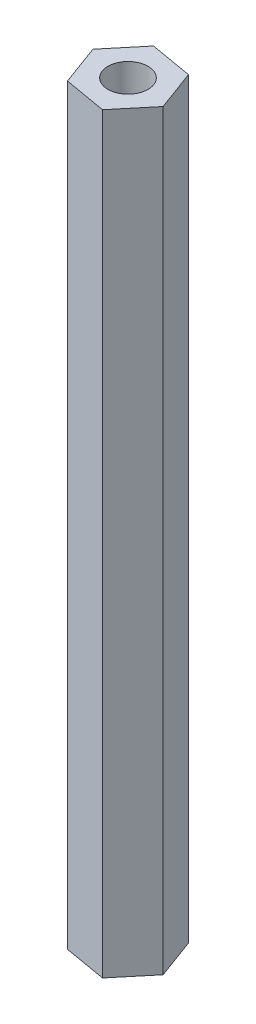
ISO-10303-21;
HEADER;
FILE_DESCRIPTION(('STEP AP214'),'2;1');
FILE_NAME('part.step','',(''),(''),'','','');
FILE_SCHEMA(('AUTOMOTIVE_DESIGN { 1 0 10303 214 1 1 1 1 }'));
ENDSEC;
DATA;
#1=APPLICATION_CONTEXT('core data for automotive mechanical design processes');
#2=APPLICATION_PROTOCOL_DEFINITION('international standard','automotive_design',2000,#1);
#3=PRODUCT_CONTEXT('',#1,'mechanical');
#4=PRODUCT('Part','Part','',(#3));
#5=PRODUCT_RELATED_PRODUCT_CATEGORY('part','',(#4));
#6=PRODUCT_DEFINITION_FORMATION('','',#4);
#7=PRODUCT_DEFINITION_CONTEXT('part definition',#1,'design');
#8=PRODUCT_DEFINITION('design','',#6,#7);
#9=PRODUCT_DEFINITION_SHAPE('','',#8);
#10=(LENGTH_UNIT() NAMED_UNIT(*) SI_UNIT(.MILLI.,.METRE.));
#11=(NAMED_UNIT(*) PLANE_ANGLE_UNIT() SI_UNIT($,.RADIAN.));
#12=(NAMED_UNIT(*) SI_UNIT($,.STERADIAN.) SOLID_ANGLE_UNIT());
#13=UNCERTAINTY_MEASURE_WITH_UNIT(LENGTH_MEASURE(1.E-05),#10,'distance_accuracy_value','');
#14=(GEOMETRIC_REPRESENTATION_CONTEXT(3) GLOBAL_UNCERTAINTY_ASSIGNED_CONTEXT((#13)) GLOBAL_UNIT_ASSIGNED_CONTEXT((#10,
#11,#12)) REPRESENTATION_CONTEXT('',''));
#15=CARTESIAN_POINT('',(0.,0.,0.));
#16=DIRECTION('',(0.,0.,1.));
#17=DIRECTION('',(1.,0.,0.));
#18=AXIS2_PLACEMENT_3D('',#15,#16,#17);
#19=CARTESIAN_POINT('',(0.,52.5,0.));
#20=DIRECTION('',(0.,1.,0.));
#21=DIRECTION('',(0.,0.,1.));
#22=AXIS2_PLACEMENT_3D('',#19,#20,#21);
#23=PLANE('',#22);
#24=DIRECTION('',(0.985494120976988,0.,0.169709568144505));
#25=VECTOR('',#24,1.);
#26=CARTESIAN_POINT('',(-1.91915957324162,52.5,2.30582447990324));
#27=LINE('',#26,#25);
#28=CARTESIAN_POINT('',(-1.91915957324162,52.5,2.30582447990324));
#29=VERTEX_POINT('',#28);
#30=CARTESIAN_POINT('',(1.03732278969237,52.5,2.81495318433728));
#31=VERTEX_POINT('',#30);
#32=EDGE_CURVE('E152',#29,#31,#27,.T.);
#33=ORIENTED_EDGE('',*,*,#32,.T.);
#34=DIRECTION('',(0.639719857783097,0.,-0.768608159960571));
#35=VECTOR('',#34,1.);
#36=CARTESIAN_POINT('',(1.03732278969237,52.5,2.81495318433728));
#37=LINE('',#36,#35);
#38=CARTESIAN_POINT('',(2.95648236296242,52.5,0.509128704550776));
#39=VERTEX_POINT('',#38);
#40=EDGE_CURVE('E100',#31,#39,#37,.T.);
#41=ORIENTED_EDGE('',*,*,#40,.T.);
#42=DIRECTION('',(-0.345774263226371,0.,-0.93831772811253));
#43=VECTOR('',#42,1.);
#44=CARTESIAN_POINT('',(2.95648236296242,52.5,0.509128704550776));
#45=LINE('',#44,#43);
#46=CARTESIAN_POINT('',(1.9191595732404,52.5,-2.30582447990324));
#47=VERTEX_POINT('',#46);
#48=EDGE_CURVE('E113',#39,#47,#45,.T.);
#49=ORIENTED_EDGE('',*,*,#48,.T.);
#50=DIRECTION('',(-0.985494120976422,0.,-0.169709568147791));
#51=VECTOR('',#50,1.);
#52=CARTESIAN_POINT('',(1.9191595732404,52.5,-2.30582447990324));
#53=LINE('',#52,#51);
#54=CARTESIAN_POINT('',(-1.03732278963464,52.5,-2.81495318433728));
#55=VERTEX_POINT('',#54);
#56=EDGE_CURVE('E107',#47,#55,#53,.T.);
#57=ORIENTED_EDGE('',*,*,#56,.T.);
#58=DIRECTION('',(-0.639719857775391,0.,0.768608159966985));
#59=VECTOR('',#58,1.);
#60=CARTESIAN_POINT('',(-1.03732278963464,52.5,-2.81495318433728));
#61=LINE('',#60,#59);
#62=CARTESIAN_POINT('',(-2.95648236296253,52.5,-0.509128704434259));
#63=VERTEX_POINT('',#62);
#64=EDGE_CURVE('E111',#55,#63,#61,.T.);
#65=ORIENTED_EDGE('',*,*,#64,.T.);
#66=DIRECTION('',(0.345774263238647,0.,0.938317728108007));
#67=VECTOR('',#66,1.);
#68=CARTESIAN_POINT('',(-2.95648236296253,52.5,-0.509128704434259));
#69=LINE('',#68,#67);
#70=EDGE_CURVE('E63',#63,#29,#69,.T.);
#71=ORIENTED_EDGE('',*,*,#70,.T.);
#72=EDGE_LOOP('',(#33,#41,#49,#57,#65,#71));
#73=FACE_BOUND('',#72,.T.);
#74=CARTESIAN_POINT('',(-2.95319324550292E-11,52.5,-2.22044604925031E-13));
#75=DIRECTION('',(0.,1.,0.));
#76=DIRECTION('',(0.,0.,1.));
#77=AXIS2_PLACEMENT_3D('',#74,#75,#76);
#78=CIRCLE('',#77,1.4000000000013);
#79=CARTESIAN_POINT('',(-2.95319324550292E-11,52.5,1.40000000000108));
#80=VERTEX_POINT('',#79);
#81=EDGE_CURVE('E140',#80,#80,#78,.T.);
#82=ORIENTED_EDGE('',*,*,#81,.F.);
#83=EDGE_LOOP('',(#82));
#84=FACE_BOUND('',#83,.T.);
#85=ADVANCED_FACE('F45',(#73,#84),#23,.T.);
#86=CARTESIAN_POINT('',(0.,0.,0.));
#87=DIRECTION('',(0.,1.,0.));
#88=DIRECTION('',(0.,0.,1.));
#89=AXIS2_PLACEMENT_3D('',#86,#87,#88);
#90=PLANE('',#89);
#91=DIRECTION('',(0.985494120976988,0.,0.169709568144505));
#92=VECTOR('',#91,1.);
#93=CARTESIAN_POINT('',(-1.91915957324162,0.,2.30582447990324));
#94=LINE('',#93,#92);
#95=CARTESIAN_POINT('',(-1.91915957324162,0.,2.30582447990324));
#96=VERTEX_POINT('',#95);
#97=CARTESIAN_POINT('',(1.03732278969237,0.,2.81495318433728));
#98=VERTEX_POINT('',#97);
#99=EDGE_CURVE('E135',#96,#98,#94,.T.);
#100=ORIENTED_EDGE('',*,*,#99,.F.);
#101=DIRECTION('',(0.345774263238647,0.,0.938317728108007));
#102=VECTOR('',#101,1.);
#103=CARTESIAN_POINT('',(-2.95648236296253,0.,-0.509128704434259));
#104=LINE('',#103,#102);
#105=CARTESIAN_POINT('',(-2.95648236296253,0.,-0.509128704434259));
#106=VERTEX_POINT('',#105);
#107=EDGE_CURVE('E92',#106,#96,#104,.T.);
#108=ORIENTED_EDGE('',*,*,#107,.F.);
#109=DIRECTION('',(-0.639719857775391,0.,0.768608159966985));
#110=VECTOR('',#109,1.);
#111=CARTESIAN_POINT('',(-1.03732278963464,0.,-2.81495318433728));
#112=LINE('',#111,#110);
#113=CARTESIAN_POINT('',(-1.03732278963464,0.,-2.81495318433728));
#114=VERTEX_POINT('',#113);
#115=EDGE_CURVE('E86',#114,#106,#112,.T.);
#116=ORIENTED_EDGE('',*,*,#115,.F.);
#117=DIRECTION('',(-0.985494120976422,0.,-0.169709568147791));
#118=VECTOR('',#117,1.);
#119=CARTESIAN_POINT('',(1.9191595732404,0.,-2.30582447990324));
#120=LINE('',#119,#118);
#121=CARTESIAN_POINT('',(1.9191595732404,0.,-2.30582447990324));
#122=VERTEX_POINT('',#121);
#123=EDGE_CURVE('E122',#122,#114,#120,.T.);
#124=ORIENTED_EDGE('',*,*,#123,.F.);
#125=DIRECTION('',(-0.345774263226371,0.,-0.93831772811253));
#126=VECTOR('',#125,1.);
#127=CARTESIAN_POINT('',(2.95648236296242,0.,0.509128704550776));
#128=LINE('',#127,#126);
#129=CARTESIAN_POINT('',(2.95648236296242,0.,0.509128704550776));
#130=VERTEX_POINT('',#129);
#131=EDGE_CURVE('E143',#130,#122,#128,.T.);
#132=ORIENTED_EDGE('',*,*,#131,.F.);
#133=DIRECTION('',(0.639719857783097,0.,-0.768608159960571));
#134=VECTOR('',#133,1.);
#135=CARTESIAN_POINT('',(1.03732278969237,0.,2.81495318433728));
#136=LINE('',#135,#134);
#137=EDGE_CURVE('E139',#98,#130,#136,.T.);
#138=ORIENTED_EDGE('',*,*,#137,.F.);
#139=EDGE_LOOP('',(#100,#108,#116,#124,#132,#138));
#140=FACE_BOUND('',#139,.T.);
#141=CARTESIAN_POINT('',(-2.95319324550292E-11,0.,-2.22044604925031E-13));
#142=DIRECTION('',(0.,1.,0.));
#143=DIRECTION('',(0.,0.,1.));
#144=AXIS2_PLACEMENT_3D('',#141,#142,#143);
#145=CIRCLE('',#144,1.4000000000013);
#146=CARTESIAN_POINT('',(-2.95319324550292E-11,0.,1.40000000000108));
#147=VERTEX_POINT('',#146);
#148=EDGE_CURVE('E249',#147,#147,#145,.T.);
#149=ORIENTED_EDGE('',*,*,#148,.T.);
#150=EDGE_LOOP('',(#149));
#151=FACE_BOUND('',#150,.T.);
#152=ADVANCED_FACE('F165',(#140,#151),#90,.F.);
#153=CARTESIAN_POINT('',(-1.91915957324162,52.5,2.30582447990324));
#154=DIRECTION('',(0.169709568144505,0.,-0.985494120976988));
#155=DIRECTION('',(-0.985494120976988,0.,-0.169709568144505));
#156=AXIS2_PLACEMENT_3D('',#153,#154,#155);
#157=PLANE('',#156);
#158=ORIENTED_EDGE('',*,*,#99,.T.);
#159=DIRECTION('',(0.,-1.,0.));
#160=VECTOR('',#159,1.);
#161=CARTESIAN_POINT('',(1.03732278969237,52.5,2.81495318433728));
#162=LINE('',#161,#160);
#163=EDGE_CURVE('E11',#31,#98,#162,.T.);
#164=ORIENTED_EDGE('',*,*,#163,.F.);
#165=ORIENTED_EDGE('',*,*,#32,.F.);
#166=DIRECTION('',(0.,-1.,0.));
#167=VECTOR('',#166,1.);
#168=CARTESIAN_POINT('',(-1.91915957324162,52.5,2.30582447990324));
#169=LINE('',#168,#167);
#170=EDGE_CURVE('E131',#29,#96,#169,.T.);
#171=ORIENTED_EDGE('',*,*,#170,.T.);
#172=EDGE_LOOP('',(#158,#164,#165,#171));
#173=FACE_BOUND('',#172,.T.);
#174=ADVANCED_FACE('F47',(#173),#157,.F.);
#175=CARTESIAN_POINT('',(1.03732278969237,52.5,2.81495318433728));
#176=DIRECTION('',(-0.76860815996057,0.,-0.639719857783097));
#177=DIRECTION('',(-0.639719857783097,0.,0.768608159960571));
#178=AXIS2_PLACEMENT_3D('',#175,#176,#177);
#179=PLANE('',#178);
#180=ORIENTED_EDGE('',*,*,#137,.T.);
#181=DIRECTION('',(0.,-1.,0.));
#182=VECTOR('',#181,1.);
#183=CARTESIAN_POINT('',(2.95648236296242,52.5,0.509128704550776));
#184=LINE('',#183,#182);
#185=EDGE_CURVE('E55',#39,#130,#184,.T.);
#186=ORIENTED_EDGE('',*,*,#185,.F.);
#187=ORIENTED_EDGE('',*,*,#40,.F.);
#188=ORIENTED_EDGE('',*,*,#163,.T.);
#189=EDGE_LOOP('',(#180,#186,#187,#188));
#190=FACE_BOUND('',#189,.T.);
#191=ADVANCED_FACE('F190',(#190),#179,.F.);
#192=CARTESIAN_POINT('',(2.95648236296242,52.5,0.509128704550776));
#193=DIRECTION('',(-0.93831772811253,0.,0.345774263226371));
#194=DIRECTION('',(0.345774263226371,0.,0.93831772811253));
#195=AXIS2_PLACEMENT_3D('',#192,#193,#194);
#196=PLANE('',#195);
#197=ORIENTED_EDGE('',*,*,#131,.T.);
#198=DIRECTION('',(0.,-1.,0.));
#199=VECTOR('',#198,1.);
#200=CARTESIAN_POINT('',(1.9191595732404,52.5,-2.30582447990324));
#201=LINE('',#200,#199);
#202=EDGE_CURVE('E124',#47,#122,#201,.T.);
#203=ORIENTED_EDGE('',*,*,#202,.F.);
#204=ORIENTED_EDGE('',*,*,#48,.F.);
#205=ORIENTED_EDGE('',*,*,#185,.T.);
#206=EDGE_LOOP('',(#197,#203,#204,#205));
#207=FACE_BOUND('',#206,.T.);
#208=ADVANCED_FACE('F162',(#207),#196,.F.);
#209=CARTESIAN_POINT('',(1.9191595732404,52.5,-2.30582447990324));
#210=DIRECTION('',(-0.169709568147791,0.,0.985494120976422));
#211=DIRECTION('',(0.985494120976422,0.,0.169709568147791));
#212=AXIS2_PLACEMENT_3D('',#209,#210,#211);
#213=PLANE('',#212);
#214=ORIENTED_EDGE('',*,*,#123,.T.);
#215=DIRECTION('',(0.,-1.,0.));
#216=VECTOR('',#215,1.);
#217=CARTESIAN_POINT('',(-1.03732278963464,52.5,-2.81495318433728));
#218=LINE('',#217,#216);
#219=EDGE_CURVE('E119',#55,#114,#218,.T.);
#220=ORIENTED_EDGE('',*,*,#219,.F.);
#221=ORIENTED_EDGE('',*,*,#56,.F.);
#222=ORIENTED_EDGE('',*,*,#202,.T.);
#223=EDGE_LOOP('',(#214,#220,#221,#222));
#224=FACE_BOUND('',#223,.T.);
#225=ADVANCED_FACE('F120',(#224),#213,.F.);
#226=CARTESIAN_POINT('',(-1.03732278963464,52.5,-2.81495318433728));
#227=DIRECTION('',(0.768608159966985,0.,0.639719857775391));
#228=DIRECTION('',(0.639719857775391,0.,-0.768608159966985));
#229=AXIS2_PLACEMENT_3D('',#226,#227,#228);
#230=PLANE('',#229);
#231=ORIENTED_EDGE('',*,*,#115,.T.);
#232=DIRECTION('',(0.,-1.,0.));
#233=VECTOR('',#232,1.);
#234=CARTESIAN_POINT('',(-2.95648236296253,52.5,-0.509128704434259));
#235=LINE('',#234,#233);
#236=EDGE_CURVE('E125',#63,#106,#235,.T.);
#237=ORIENTED_EDGE('',*,*,#236,.F.);
#238=ORIENTED_EDGE('',*,*,#64,.F.);
#239=ORIENTED_EDGE('',*,*,#219,.T.);
#240=EDGE_LOOP('',(#231,#237,#238,#239));
#241=FACE_BOUND('',#240,.T.);
#242=ADVANCED_FACE('F127',(#241),#230,.F.);
#243=CARTESIAN_POINT('',(-2.95648236296253,52.5,-0.509128704434259));
#244=DIRECTION('',(0.938317728108007,0.,-0.345774263238647));
#245=DIRECTION('',(-0.345774263238647,0.,-0.938317728108007));
#246=AXIS2_PLACEMENT_3D('',#243,#244,#245);
#247=PLANE('',#246);
#248=ORIENTED_EDGE('',*,*,#107,.T.);
#249=ORIENTED_EDGE('',*,*,#170,.F.);
#250=ORIENTED_EDGE('',*,*,#70,.F.);
#251=ORIENTED_EDGE('',*,*,#236,.T.);
#252=EDGE_LOOP('',(#248,#249,#250,#251));
#253=FACE_BOUND('',#252,.T.);
#254=ADVANCED_FACE('F170',(#253),#247,.F.);
#255=CARTESIAN_POINT('',(-2.95319324550292E-11,52.5,-2.22044604925031E-13));
#256=DIRECTION('',(0.,-1.,0.));
#257=DIRECTION('',(0.,0.,-1.));
#258=AXIS2_PLACEMENT_3D('',#255,#256,#257);
#259=CYLINDRICAL_SURFACE('',#258,1.4000000000013);
#260=ORIENTED_EDGE('',*,*,#81,.T.);
#261=EDGE_LOOP('',(#260));
#262=FACE_BOUND('',#261,.T.);
#263=ORIENTED_EDGE('',*,*,#148,.F.);
#264=EDGE_LOOP('',(#263));
#265=FACE_BOUND('',#264,.T.);
#266=ADVANCED_FACE('F172',(#262,#265),#259,.F.);
#267=CLOSED_SHELL('',(#85,#152,#174,#191,#208,#225,#242,#254,#266));
#268=MANIFOLD_SOLID_BREP('B2',#267);
#269=ADVANCED_BREP_SHAPE_REPRESENTATION('',(#18,#268),#14);
#270=SHAPE_DEFINITION_REPRESENTATION(#9,#269);
ENDSEC;
END-ISO-10303-21;
